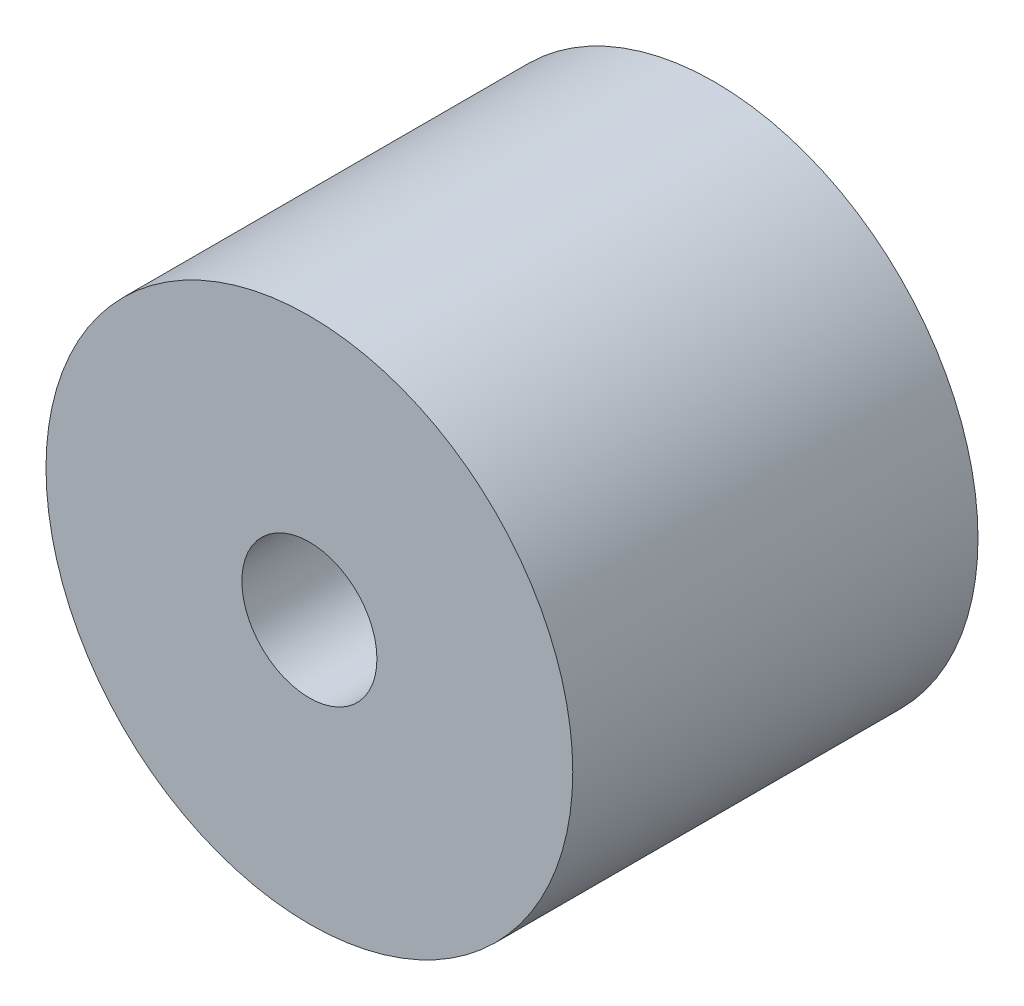
ISO-10303-21;
HEADER;
FILE_DESCRIPTION(('STEP AP214'),'2;1');
FILE_NAME('part.step','',(''),(''),'','','');
FILE_SCHEMA(('AUTOMOTIVE_DESIGN { 1 0 10303 214 1 1 1 1 }'));
ENDSEC;
DATA;
#1=APPLICATION_CONTEXT('core data for automotive mechanical design processes');
#2=APPLICATION_PROTOCOL_DEFINITION('international standard','automotive_design',2000,#1);
#3=PRODUCT_CONTEXT('',#1,'mechanical');
#4=PRODUCT('Part','Part','',(#3));
#5=PRODUCT_RELATED_PRODUCT_CATEGORY('part','',(#4));
#6=PRODUCT_DEFINITION_FORMATION('','',#4);
#7=PRODUCT_DEFINITION_CONTEXT('part definition',#1,'design');
#8=PRODUCT_DEFINITION('design','',#6,#7);
#9=PRODUCT_DEFINITION_SHAPE('','',#8);
#10=(LENGTH_UNIT() NAMED_UNIT(*) SI_UNIT(.MILLI.,.METRE.));
#11=(NAMED_UNIT(*) PLANE_ANGLE_UNIT() SI_UNIT($,.RADIAN.));
#12=(NAMED_UNIT(*) SI_UNIT($,.STERADIAN.) SOLID_ANGLE_UNIT());
#13=UNCERTAINTY_MEASURE_WITH_UNIT(LENGTH_MEASURE(1.E-05),#10,'distance_accuracy_value','');
#14=(GEOMETRIC_REPRESENTATION_CONTEXT(3) GLOBAL_UNCERTAINTY_ASSIGNED_CONTEXT((#13)) GLOBAL_UNIT_ASSIGNED_CONTEXT((#10,
#11,#12)) REPRESENTATION_CONTEXT('',''));
#15=CARTESIAN_POINT('',(0.,0.,0.));
#16=DIRECTION('',(0.,0.,1.));
#17=DIRECTION('',(1.,0.,0.));
#18=AXIS2_PLACEMENT_3D('',#15,#16,#17);
#19=CARTESIAN_POINT('',(0.,0.,15.));
#20=DIRECTION('',(0.,0.,-1.));
#21=DIRECTION('',(-1.,0.,0.));
#22=AXIS2_PLACEMENT_3D('',#19,#20,#21);
#23=CYLINDRICAL_SURFACE('',#22,19.5);
#24=CARTESIAN_POINT('',(0.,0.,15.));
#25=DIRECTION('',(0.,0.,1.));
#26=DIRECTION('',(1.,0.,0.));
#27=AXIS2_PLACEMENT_3D('',#24,#25,#26);
#28=CIRCLE('',#27,19.5);
#29=CARTESIAN_POINT('',(19.5,0.,15.));
#30=VERTEX_POINT('',#29);
#31=EDGE_CURVE('E12',#30,#30,#28,.T.);
#32=ORIENTED_EDGE('',*,*,#31,.F.);
#33=EDGE_LOOP('',(#32));
#34=FACE_BOUND('',#33,.T.);
#35=CARTESIAN_POINT('',(0.,0.,-15.));
#36=DIRECTION('',(0.,0.,1.));
#37=DIRECTION('',(1.,0.,0.));
#38=AXIS2_PLACEMENT_3D('',#35,#36,#37);
#39=CIRCLE('',#38,19.5);
#40=CARTESIAN_POINT('',(19.5,0.,-15.));
#41=VERTEX_POINT('',#40);
#42=EDGE_CURVE('E49',#41,#41,#39,.T.);
#43=ORIENTED_EDGE('',*,*,#42,.T.);
#44=EDGE_LOOP('',(#43));
#45=FACE_BOUND('',#44,.T.);
#46=ADVANCED_FACE('F42',(#34,#45),#23,.T.);
#47=CARTESIAN_POINT('',(0.,0.,15.));
#48=DIRECTION('',(0.,0.,1.));
#49=DIRECTION('',(1.,0.,0.));
#50=AXIS2_PLACEMENT_3D('',#47,#48,#49);
#51=PLANE('',#50);
#52=CARTESIAN_POINT('',(0.,0.,15.));
#53=DIRECTION('',(0.,0.,1.));
#54=DIRECTION('',(1.,0.,0.));
#55=AXIS2_PLACEMENT_3D('',#52,#53,#54);
#56=CIRCLE('',#55,5.);
#57=CARTESIAN_POINT('',(5.,0.,15.));
#58=VERTEX_POINT('',#57);
#59=EDGE_CURVE('E55',#58,#58,#56,.T.);
#60=ORIENTED_EDGE('',*,*,#59,.F.);
#61=EDGE_LOOP('',(#60));
#62=FACE_BOUND('',#61,.T.);
#63=ORIENTED_EDGE('',*,*,#31,.T.);
#64=EDGE_LOOP('',(#63));
#65=FACE_BOUND('',#64,.T.);
#66=ADVANCED_FACE('F71',(#62,#65),#51,.T.);
#67=CARTESIAN_POINT('',(0.,0.,-15.));
#68=DIRECTION('',(0.,0.,1.));
#69=DIRECTION('',(1.,0.,0.));
#70=AXIS2_PLACEMENT_3D('',#67,#68,#69);
#71=PLANE('',#70);
#72=CARTESIAN_POINT('',(0.,0.,-15.));
#73=DIRECTION('',(0.,0.,1.));
#74=DIRECTION('',(1.,0.,0.));
#75=AXIS2_PLACEMENT_3D('',#72,#73,#74);
#76=CIRCLE('',#75,5.);
#77=CARTESIAN_POINT('',(5.,0.,-15.));
#78=VERTEX_POINT('',#77);
#79=EDGE_CURVE('E45',#78,#78,#76,.T.);
#80=ORIENTED_EDGE('',*,*,#79,.T.);
#81=EDGE_LOOP('',(#80));
#82=FACE_BOUND('',#81,.T.);
#83=ORIENTED_EDGE('',*,*,#42,.F.);
#84=EDGE_LOOP('',(#83));
#85=FACE_BOUND('',#84,.T.);
#86=ADVANCED_FACE('F62',(#82,#85),#71,.F.);
#87=CARTESIAN_POINT('',(0.,0.,-17.));
#88=DIRECTION('',(0.,0.,1.));
#89=DIRECTION('',(1.,0.,0.));
#90=AXIS2_PLACEMENT_3D('',#87,#88,#89);
#91=CYLINDRICAL_SURFACE('',#90,5.);
#92=ORIENTED_EDGE('',*,*,#59,.T.);
#93=EDGE_LOOP('',(#92));
#94=FACE_BOUND('',#93,.T.);
#95=ORIENTED_EDGE('',*,*,#79,.F.);
#96=EDGE_LOOP('',(#95));
#97=FACE_BOUND('',#96,.T.);
#98=ADVANCED_FACE('F65',(#94,#97),#91,.F.);
#99=CLOSED_SHELL('',(#46,#66,#86,#98));
#100=MANIFOLD_SOLID_BREP('B2',#99);
#101=ADVANCED_BREP_SHAPE_REPRESENTATION('',(#18,#100),#14);
#102=SHAPE_DEFINITION_REPRESENTATION(#9,#101);
ENDSEC;
END-ISO-10303-21;
